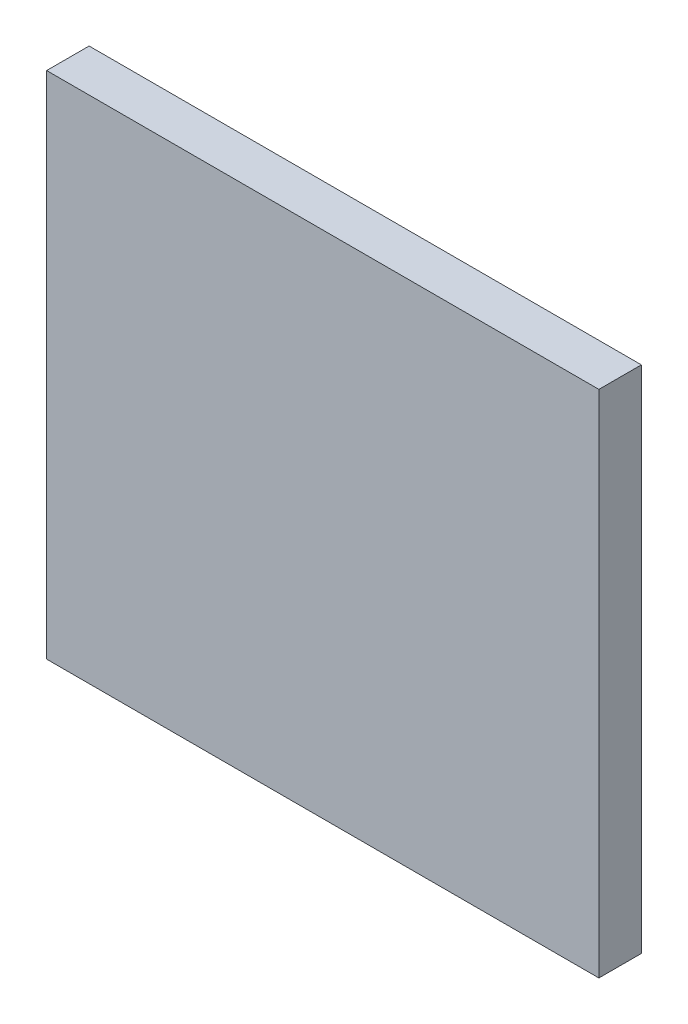
ISO-10303-21;
HEADER;
FILE_DESCRIPTION(('STEP AP214'),'2;1');
FILE_NAME('part.step','',(''),(''),'','','');
FILE_SCHEMA(('AUTOMOTIVE_DESIGN { 1 0 10303 214 1 1 1 1 }'));
ENDSEC;
DATA;
#1=APPLICATION_CONTEXT('core data for automotive mechanical design processes');
#2=APPLICATION_PROTOCOL_DEFINITION('international standard','automotive_design',2000,#1);
#3=PRODUCT_CONTEXT('',#1,'mechanical');
#4=PRODUCT('Part','Part','',(#3));
#5=PRODUCT_RELATED_PRODUCT_CATEGORY('part','',(#4));
#6=PRODUCT_DEFINITION_FORMATION('','',#4);
#7=PRODUCT_DEFINITION_CONTEXT('part definition',#1,'design');
#8=PRODUCT_DEFINITION('design','',#6,#7);
#9=PRODUCT_DEFINITION_SHAPE('','',#8);
#10=(LENGTH_UNIT() NAMED_UNIT(*) SI_UNIT(.MILLI.,.METRE.));
#11=(NAMED_UNIT(*) PLANE_ANGLE_UNIT() SI_UNIT($,.RADIAN.));
#12=(NAMED_UNIT(*) SI_UNIT($,.STERADIAN.) SOLID_ANGLE_UNIT());
#13=UNCERTAINTY_MEASURE_WITH_UNIT(LENGTH_MEASURE(1.E-05),#10,'distance_accuracy_value','');
#14=(GEOMETRIC_REPRESENTATION_CONTEXT(3) GLOBAL_UNCERTAINTY_ASSIGNED_CONTEXT((#13)) GLOBAL_UNIT_ASSIGNED_CONTEXT((#10,
#11,#12)) REPRESENTATION_CONTEXT('',''));
#15=CARTESIAN_POINT('',(0.,0.,0.));
#16=DIRECTION('',(0.,0.,1.));
#17=DIRECTION('',(1.,0.,0.));
#18=AXIS2_PLACEMENT_3D('',#15,#16,#17);
#19=CARTESIAN_POINT('',(-59.1803278688524,36.2295081967213,5.));
#20=DIRECTION('',(1.,0.,0.));
#21=DIRECTION('',(0.,1.,0.));
#22=AXIS2_PLACEMENT_3D('',#19,#20,#21);
#23=PLANE('',#22);
#24=DIRECTION('',(0.,-1.,0.));
#25=VECTOR('',#24,1.);
#26=CARTESIAN_POINT('',(-59.1803278688524,36.2295081967213,0.));
#27=LINE('',#26,#25);
#28=CARTESIAN_POINT('',(-59.1803278688524,36.2295081967213,0.));
#29=VERTEX_POINT('',#28);
#30=CARTESIAN_POINT('',(-59.1803278688524,-23.7704918032787,0.));
#31=VERTEX_POINT('',#30);
#32=EDGE_CURVE('E98',#29,#31,#27,.T.);
#33=ORIENTED_EDGE('',*,*,#32,.T.);
#34=DIRECTION('',(0.,0.,-1.));
#35=VECTOR('',#34,1.);
#36=CARTESIAN_POINT('',(-59.1803278688524,-23.7704918032787,5.));
#37=LINE('',#36,#35);
#38=CARTESIAN_POINT('',(-59.1803278688524,-23.7704918032787,5.));
#39=VERTEX_POINT('',#38);
#40=EDGE_CURVE('E11',#39,#31,#37,.T.);
#41=ORIENTED_EDGE('',*,*,#40,.F.);
#42=DIRECTION('',(0.,-1.,0.));
#43=VECTOR('',#42,1.);
#44=CARTESIAN_POINT('',(-59.1803278688524,36.2295081967213,5.));
#45=LINE('',#44,#43);
#46=CARTESIAN_POINT('',(-59.1803278688524,36.2295081967213,5.));
#47=VERTEX_POINT('',#46);
#48=EDGE_CURVE('E86',#47,#39,#45,.T.);
#49=ORIENTED_EDGE('',*,*,#48,.F.);
#50=DIRECTION('',(0.,0.,-1.));
#51=VECTOR('',#50,1.);
#52=CARTESIAN_POINT('',(-59.1803278688524,36.2295081967213,5.));
#53=LINE('',#52,#51);
#54=EDGE_CURVE('E94',#47,#29,#53,.T.);
#55=ORIENTED_EDGE('',*,*,#54,.T.);
#56=EDGE_LOOP('',(#33,#41,#49,#55));
#57=FACE_BOUND('',#56,.T.);
#58=ADVANCED_FACE('F35',(#57),#23,.F.);
#59=CARTESIAN_POINT('',(-59.1803278688524,-23.7704918032787,5.));
#60=DIRECTION('',(0.,1.,0.));
#61=DIRECTION('',(0.,0.,1.));
#62=AXIS2_PLACEMENT_3D('',#59,#60,#61);
#63=PLANE('',#62);
#64=DIRECTION('',(1.,0.,0.));
#65=VECTOR('',#64,1.);
#66=CARTESIAN_POINT('',(-59.1803278688524,-23.7704918032787,0.));
#67=LINE('',#66,#65);
#68=CARTESIAN_POINT('',(5.81967213114759,-23.7704918032787,0.));
#69=VERTEX_POINT('',#68);
#70=EDGE_CURVE('E90',#31,#69,#67,.T.);
#71=ORIENTED_EDGE('',*,*,#70,.T.);
#72=DIRECTION('',(0.,0.,-1.));
#73=VECTOR('',#72,1.);
#74=CARTESIAN_POINT('',(5.81967213114759,-23.7704918032787,5.));
#75=LINE('',#74,#73);
#76=CARTESIAN_POINT('',(5.81967213114759,-23.7704918032787,5.));
#77=VERTEX_POINT('',#76);
#78=EDGE_CURVE('E43',#77,#69,#75,.T.);
#79=ORIENTED_EDGE('',*,*,#78,.F.);
#80=DIRECTION('',(1.,0.,0.));
#81=VECTOR('',#80,1.);
#82=CARTESIAN_POINT('',(-59.1803278688524,-23.7704918032787,5.));
#83=LINE('',#82,#81);
#84=EDGE_CURVE('E81',#39,#77,#83,.T.);
#85=ORIENTED_EDGE('',*,*,#84,.F.);
#86=ORIENTED_EDGE('',*,*,#40,.T.);
#87=EDGE_LOOP('',(#71,#79,#85,#86));
#88=FACE_BOUND('',#87,.T.);
#89=ADVANCED_FACE('F89',(#88),#63,.F.);
#90=CARTESIAN_POINT('',(5.81967213114757,36.2295081967213,5.));
#91=DIRECTION('',(-1.,0.,0.));
#92=DIRECTION('',(0.,-1.,0.));
#93=AXIS2_PLACEMENT_3D('',#90,#91,#92);
#94=PLANE('',#93);
#95=DIRECTION('',(0.,1.,0.));
#96=VECTOR('',#95,1.);
#97=CARTESIAN_POINT('',(5.81967213114757,36.2295081967213,0.));
#98=LINE('',#97,#96);
#99=CARTESIAN_POINT('',(5.81967213114757,36.2295081967213,0.));
#100=VERTEX_POINT('',#99);
#101=EDGE_CURVE('E68',#69,#100,#98,.T.);
#102=ORIENTED_EDGE('',*,*,#101,.T.);
#103=DIRECTION('',(0.,0.,-1.));
#104=VECTOR('',#103,1.);
#105=CARTESIAN_POINT('',(5.81967213114757,36.2295081967213,5.));
#106=LINE('',#105,#104);
#107=CARTESIAN_POINT('',(5.81967213114757,36.2295081967213,5.));
#108=VERTEX_POINT('',#107);
#109=EDGE_CURVE('E91',#108,#100,#106,.T.);
#110=ORIENTED_EDGE('',*,*,#109,.F.);
#111=DIRECTION('',(0.,1.,0.));
#112=VECTOR('',#111,1.);
#113=CARTESIAN_POINT('',(5.81967213114757,36.2295081967213,5.));
#114=LINE('',#113,#112);
#115=EDGE_CURVE('E84',#77,#108,#114,.T.);
#116=ORIENTED_EDGE('',*,*,#115,.F.);
#117=ORIENTED_EDGE('',*,*,#78,.T.);
#118=EDGE_LOOP('',(#102,#110,#116,#117));
#119=FACE_BOUND('',#118,.T.);
#120=ADVANCED_FACE('F92',(#119),#94,.F.);
#121=CARTESIAN_POINT('',(-59.1803278688524,36.2295081967213,5.));
#122=DIRECTION('',(0.,-1.,0.));
#123=DIRECTION('',(0.,0.,-1.));
#124=AXIS2_PLACEMENT_3D('',#121,#122,#123);
#125=PLANE('',#124);
#126=DIRECTION('',(-1.,0.,0.));
#127=VECTOR('',#126,1.);
#128=CARTESIAN_POINT('',(-59.1803278688524,36.2295081967213,0.));
#129=LINE('',#128,#127);
#130=EDGE_CURVE('E74',#100,#29,#129,.T.);
#131=ORIENTED_EDGE('',*,*,#130,.T.);
#132=ORIENTED_EDGE('',*,*,#54,.F.);
#133=DIRECTION('',(-1.,0.,0.));
#134=VECTOR('',#133,1.);
#135=CARTESIAN_POINT('',(-59.1803278688524,36.2295081967213,5.));
#136=LINE('',#135,#134);
#137=EDGE_CURVE('E51',#108,#47,#136,.T.);
#138=ORIENTED_EDGE('',*,*,#137,.F.);
#139=ORIENTED_EDGE('',*,*,#109,.T.);
#140=EDGE_LOOP('',(#131,#132,#138,#139));
#141=FACE_BOUND('',#140,.T.);
#142=ADVANCED_FACE('F105',(#141),#125,.F.);
#143=CARTESIAN_POINT('',(0.,0.,5.));
#144=DIRECTION('',(0.,0.,1.));
#145=DIRECTION('',(1.,0.,0.));
#146=AXIS2_PLACEMENT_3D('',#143,#144,#145);
#147=PLANE('',#146);
#148=ORIENTED_EDGE('',*,*,#48,.T.);
#149=ORIENTED_EDGE('',*,*,#84,.T.);
#150=ORIENTED_EDGE('',*,*,#115,.T.);
#151=ORIENTED_EDGE('',*,*,#137,.T.);
#152=EDGE_LOOP('',(#148,#149,#150,#151));
#153=FACE_BOUND('',#152,.T.);
#154=ADVANCED_FACE('F82',(#153),#147,.T.);
#155=CARTESIAN_POINT('',(0.,0.,0.));
#156=DIRECTION('',(0.,0.,1.));
#157=DIRECTION('',(1.,0.,0.));
#158=AXIS2_PLACEMENT_3D('',#155,#156,#157);
#159=PLANE('',#158);
#160=ORIENTED_EDGE('',*,*,#32,.F.);
#161=ORIENTED_EDGE('',*,*,#130,.F.);
#162=ORIENTED_EDGE('',*,*,#101,.F.);
#163=ORIENTED_EDGE('',*,*,#70,.F.);
#164=EDGE_LOOP('',(#160,#161,#162,#163));
#165=FACE_BOUND('',#164,.T.);
#166=ADVANCED_FACE('F108',(#165),#159,.F.);
#167=CLOSED_SHELL('',(#58,#89,#120,#142,#154,#166));
#168=MANIFOLD_SOLID_BREP('B2',#167);
#169=ADVANCED_BREP_SHAPE_REPRESENTATION('',(#18,#168),#14);
#170=SHAPE_DEFINITION_REPRESENTATION(#9,#169);
ENDSEC;
END-ISO-10303-21;
